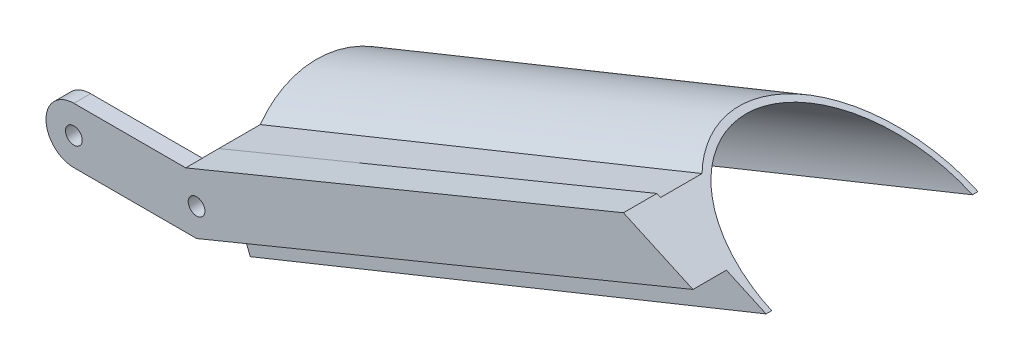
ISO-10303-21;
HEADER;
FILE_DESCRIPTION(('STEP AP214'),'2;1');
FILE_NAME('part.step','',(''),(''),'','','');
FILE_SCHEMA(('AUTOMOTIVE_DESIGN { 1 0 10303 214 1 1 1 1 }'));
ENDSEC;
DATA;
#1=APPLICATION_CONTEXT('core data for automotive mechanical design processes');
#2=APPLICATION_PROTOCOL_DEFINITION('international standard','automotive_design',2000,#1);
#3=PRODUCT_CONTEXT('',#1,'mechanical');
#4=PRODUCT('Part','Part','',(#3));
#5=PRODUCT_RELATED_PRODUCT_CATEGORY('part','',(#4));
#6=PRODUCT_DEFINITION_FORMATION('','',#4);
#7=PRODUCT_DEFINITION_CONTEXT('part definition',#1,'design');
#8=PRODUCT_DEFINITION('design','',#6,#7);
#9=PRODUCT_DEFINITION_SHAPE('','',#8);
#10=(LENGTH_UNIT() NAMED_UNIT(*) SI_UNIT(.MILLI.,.METRE.));
#11=(NAMED_UNIT(*) PLANE_ANGLE_UNIT() SI_UNIT($,.RADIAN.));
#12=(NAMED_UNIT(*) SI_UNIT($,.STERADIAN.) SOLID_ANGLE_UNIT());
#13=UNCERTAINTY_MEASURE_WITH_UNIT(LENGTH_MEASURE(1.E-05),#10,'distance_accuracy_value','');
#14=(GEOMETRIC_REPRESENTATION_CONTEXT(3) GLOBAL_UNCERTAINTY_ASSIGNED_CONTEXT((#13)) GLOBAL_UNIT_ASSIGNED_CONTEXT((#10,
#11,#12)) REPRESENTATION_CONTEXT('',''));
#15=CARTESIAN_POINT('',(0.,0.,0.));
#16=DIRECTION('',(0.,0.,1.));
#17=DIRECTION('',(1.,0.,0.));
#18=AXIS2_PLACEMENT_3D('',#15,#16,#17);
#19=CARTESIAN_POINT('',(22.,0.,-3.));
#20=DIRECTION('',(0.,0.,-1.));
#21=DIRECTION('',(-1.,0.,0.));
#22=AXIS2_PLACEMENT_3D('',#19,#20,#21);
#23=PLANE('',#22);
#24=DIRECTION('',(0.910039172794664,-0.414522259932087,0.));
#25=VECTOR('',#24,1.);
#26=CARTESIAN_POINT('',(111.008388468843,31.595772859895,-3.));
#27=LINE('',#26,#25);
#28=CARTESIAN_POINT('',(98.5445869727126,37.2730264528967,-3.));
#29=VERTEX_POINT('',#28);
#30=CARTESIAN_POINT('',(99.2027026899752,36.9732551654929,-3.));
#31=VERTEX_POINT('',#30);
#32=EDGE_CURVE('E222',#29,#31,#27,.T.);
#33=ORIENTED_EDGE('',*,*,#32,.T.);
#34=DIRECTION('',(-0.927208597794586,-0.374545345953994,0.));
#35=VECTOR('',#34,1.);
#36=CARTESIAN_POINT('',(150.967749391002,57.8837141183942,-3.));
#37=LINE('',#36,#35);
#38=CARTESIAN_POINT('',(19.9901870179728,4.97540790995101,-3.));
#39=VERTEX_POINT('',#38);
#40=EDGE_CURVE('E191',#31,#39,#37,.T.);
#41=ORIENTED_EDGE('',*,*,#40,.T.);
#42=DIRECTION('',(0.924878228166549,0.380263412733207,0.));
#43=VECTOR('',#42,1.);
#44=CARTESIAN_POINT('',(98.5445869727126,37.2730264528967,-3.));
#45=LINE('',#44,#43);
#46=EDGE_CURVE('E218',#39,#29,#45,.T.);
#47=ORIENTED_EDGE('',*,*,#46,.T.);
#48=EDGE_LOOP('',(#33,#41,#47));
#49=FACE_BOUND('',#48,.T.);
#50=ADVANCED_FACE('F41',(#49),#23,.T.);
#51=CARTESIAN_POINT('',(0.,0.,0.));
#52=DIRECTION('',(0.,0.,1.));
#53=DIRECTION('',(1.,0.,0.));
#54=AXIS2_PLACEMENT_3D('',#51,#52,#53);
#55=PLANE('',#54);
#56=CARTESIAN_POINT('',(0.,0.,0.));
#57=DIRECTION('',(0.,0.,1.));
#58=DIRECTION('',(1.,0.,0.));
#59=AXIS2_PLACEMENT_3D('',#56,#57,#58);
#60=CIRCLE('',#59,1.5);
#61=CARTESIAN_POINT('',(1.5,0.,0.));
#62=VERTEX_POINT('',#61);
#63=EDGE_CURVE('E298',#62,#62,#60,.T.);
#64=ORIENTED_EDGE('',*,*,#63,.T.);
#65=EDGE_LOOP('',(#64));
#66=FACE_BOUND('',#65,.T.);
#67=CARTESIAN_POINT('',(22.,0.,0.));
#68=DIRECTION('',(0.,0.,1.));
#69=DIRECTION('',(1.,0.,0.));
#70=AXIS2_PLACEMENT_3D('',#67,#68,#69);
#71=CIRCLE('',#70,1.5);
#72=CARTESIAN_POINT('',(23.5,0.,0.));
#73=VERTEX_POINT('',#72);
#74=EDGE_CURVE('E263',#73,#73,#71,.T.);
#75=ORIENTED_EDGE('',*,*,#74,.T.);
#76=EDGE_LOOP('',(#75));
#77=FACE_BOUND('',#76,.T.);
#78=DIRECTION('',(-0.374545345953993,0.927208597794587,0.));
#79=VECTOR('',#78,1.);
#80=CARTESIAN_POINT('',(22.936363364885,-2.31802149448646,0.));
#81=LINE('',#80,#79);
#82=CARTESIAN_POINT('',(23.7320771990458,-4.28785696671421,0.));
#83=VERTEX_POINT('',#82);
#84=CARTESIAN_POINT('',(22.936363364885,-2.31802149448646,0.));
#85=VERTEX_POINT('',#84);
#86=EDGE_CURVE('E214',#83,#85,#81,.T.);
#87=ORIENTED_EDGE('',*,*,#86,.F.);
#88=DIRECTION('',(-0.924878228166549,-0.380263412733207,0.));
#89=VECTOR('',#88,1.);
#90=CARTESIAN_POINT('',(4.9396925444234,-12.0143404155981,0.));
#91=LINE('',#90,#89);
#92=CARTESIAN_POINT('',(22.,-5.,0.));
#93=VERTEX_POINT('',#92);
#94=EDGE_CURVE('E302',#83,#93,#91,.T.);
#95=ORIENTED_EDGE('',*,*,#94,.T.);
#96=DIRECTION('',(1.,0.,0.));
#97=VECTOR('',#96,1.);
#98=CARTESIAN_POINT('',(0.,-5.,0.));
#99=LINE('',#98,#97);
#100=CARTESIAN_POINT('',(0.,-5.,0.));
#101=VERTEX_POINT('',#100);
#102=EDGE_CURVE('E272',#101,#93,#99,.T.);
#103=ORIENTED_EDGE('',*,*,#102,.F.);
#104=CARTESIAN_POINT('',(0.,0.,0.));
#105=DIRECTION('',(0.,0.,1.));
#106=DIRECTION('',(1.,0.,0.));
#107=AXIS2_PLACEMENT_3D('',#104,#105,#106);
#108=CIRCLE('',#107,5.);
#109=CARTESIAN_POINT('',(0.,5.,0.));
#110=VERTEX_POINT('',#109);
#111=EDGE_CURVE('E308',#110,#101,#108,.T.);
#112=ORIENTED_EDGE('',*,*,#111,.F.);
#113=DIRECTION('',(1.,0.,0.));
#114=VECTOR('',#113,1.);
#115=CARTESIAN_POINT('',(0.,5.,0.));
#116=LINE('',#115,#114);
#117=CARTESIAN_POINT('',(20.05,5.,0.));
#118=VERTEX_POINT('',#117);
#119=EDGE_CURVE('E305',#110,#118,#116,.T.);
#120=ORIENTED_EDGE('',*,*,#119,.T.);
#121=DIRECTION('',(0.924878228166549,0.380263412733207,0.));
#122=VECTOR('',#121,1.);
#123=CARTESIAN_POINT('',(98.5445869727126,37.2730264528967,0.));
#124=LINE('',#123,#122);
#125=CARTESIAN_POINT('',(19.9901870179728,4.97540790995101,0.));
#126=VERTEX_POINT('',#125);
#127=EDGE_CURVE('E57',#126,#118,#124,.T.);
#128=ORIENTED_EDGE('',*,*,#127,.F.);
#129=DIRECTION('',(-0.374545345953994,0.927208597794586,0.));
#130=VECTOR('',#129,1.);
#131=CARTESIAN_POINT('',(19.9901870179728,4.97540790995101,0.));
#132=LINE('',#131,#130);
#133=CARTESIAN_POINT('',(21.063636635115,2.31802149448647,0.));
#134=VERTEX_POINT('',#133);
#135=EDGE_CURVE('E235',#134,#126,#132,.T.);
#136=ORIENTED_EDGE('',*,*,#135,.F.);
#137=CARTESIAN_POINT('',(22.,0.,0.));
#138=DIRECTION('',(0.,0.,1.));
#139=DIRECTION('',(-1.,0.,0.));
#140=AXIS2_PLACEMENT_3D('',#137,#138,#139);
#141=CIRCLE('',#140,2.5);
#142=EDGE_CURVE('E63',#85,#134,#141,.T.);
#143=ORIENTED_EDGE('',*,*,#142,.F.);
#144=EDGE_LOOP('',(#87,#95,#103,#112,#120,#128,#136,#143));
#145=FACE_BOUND('',#144,.T.);
#146=ADVANCED_FACE('F330',(#66,#77,#145),#55,.F.);
#147=CARTESIAN_POINT('',(4.9396925444234,-12.0143404155981,3.));
#148=DIRECTION('',(0.380263412733207,-0.924878228166549,0.));
#149=DIRECTION('',(0.924878228166549,0.380263412733207,0.));
#150=AXIS2_PLACEMENT_3D('',#147,#148,#149);
#151=PLANE('',#150);
#152=ORIENTED_EDGE('',*,*,#94,.F.);
#153=DIRECTION('',(0.,0.,1.));
#154=VECTOR('',#153,1.);
#155=CARTESIAN_POINT('',(23.7320771990458,-4.28785696671419,-3.));
#156=LINE('',#155,#154);
#157=CARTESIAN_POINT('',(23.7320771990458,-4.28785696671419,-3.));
#158=VERTEX_POINT('',#157);
#159=EDGE_CURVE('E229',#158,#83,#156,.T.);
#160=ORIENTED_EDGE('',*,*,#159,.F.);
#161=DIRECTION('',(-0.924878228166549,-0.380263412733207,0.));
#162=VECTOR('',#161,1.);
#163=CARTESIAN_POINT('',(111.008388468843,31.595772859895,-3.));
#164=LINE('',#163,#162);
#165=CARTESIAN_POINT('',(111.008388468843,31.595772859895,-3.));
#166=VERTEX_POINT('',#165);
#167=EDGE_CURVE('E226',#166,#158,#164,.T.);
#168=ORIENTED_EDGE('',*,*,#167,.F.);
#169=DIRECTION('',(0.,0.,1.));
#170=VECTOR('',#169,1.);
#171=CARTESIAN_POINT('',(111.008388468843,31.595772859895,-70.0584015433783));
#172=LINE('',#171,#170);
#173=CARTESIAN_POINT('',(111.008388468843,31.595772859895,3.));
#174=VERTEX_POINT('',#173);
#175=EDGE_CURVE('E258',#166,#174,#172,.T.);
#176=ORIENTED_EDGE('',*,*,#175,.T.);
#177=DIRECTION('',(-0.924878228166549,-0.380263412733207,0.));
#178=VECTOR('',#177,1.);
#179=CARTESIAN_POINT('',(4.9396925444234,-12.0143404155981,3.));
#180=LINE('',#179,#178);
#181=CARTESIAN_POINT('',(22.,-5.,3.));
#182=VERTEX_POINT('',#181);
#183=EDGE_CURVE('E276',#174,#182,#180,.T.);
#184=ORIENTED_EDGE('',*,*,#183,.T.);
#185=DIRECTION('',(0.,0.,-1.));
#186=VECTOR('',#185,1.);
#187=CARTESIAN_POINT('',(22.,-5.,3.));
#188=LINE('',#187,#186);
#189=EDGE_CURVE('E294',#182,#93,#188,.T.);
#190=ORIENTED_EDGE('',*,*,#189,.T.);
#191=EDGE_LOOP('',(#152,#160,#168,#176,#184,#190));
#192=FACE_BOUND('',#191,.T.);
#193=ADVANCED_FACE('F357',(#192),#151,.T.);
#194=CARTESIAN_POINT('',(1.14074851739701,-2.77453321099285,3.));
#195=DIRECTION('',(-0.380263412733207,0.924878228166549,0.));
#196=DIRECTION('',(-0.924878228166549,-0.380263412733207,0.));
#197=AXIS2_PLACEMENT_3D('',#194,#195,#196);
#198=PLANE('',#197);
#199=DIRECTION('',(0.,0.,1.));
#200=VECTOR('',#199,1.);
#201=CARTESIAN_POINT('',(98.5445869727126,37.2730264528967,-70.0584015433783));
#202=LINE('',#201,#200);
#203=CARTESIAN_POINT('',(98.5445869727126,37.2730264528967,3.));
#204=VERTEX_POINT('',#203);
#205=EDGE_CURVE('E259',#29,#204,#202,.T.);
#206=ORIENTED_EDGE('',*,*,#205,.F.);
#207=ORIENTED_EDGE('',*,*,#46,.F.);
#208=DIRECTION('',(0.,0.,1.));
#209=VECTOR('',#208,1.);
#210=CARTESIAN_POINT('',(19.9901870179728,4.97540790995101,-3.));
#211=LINE('',#210,#209);
#212=EDGE_CURVE('E243',#39,#126,#211,.T.);
#213=ORIENTED_EDGE('',*,*,#212,.T.);
#214=ORIENTED_EDGE('',*,*,#127,.T.);
#215=DIRECTION('',(0.,0.,-1.));
#216=VECTOR('',#215,1.);
#217=CARTESIAN_POINT('',(20.05,5.,3.));
#218=LINE('',#217,#216);
#219=CARTESIAN_POINT('',(20.05,5.,3.));
#220=VERTEX_POINT('',#219);
#221=EDGE_CURVE('E11',#220,#118,#218,.T.);
#222=ORIENTED_EDGE('',*,*,#221,.F.);
#223=DIRECTION('',(0.924878228166549,0.380263412733207,0.));
#224=VECTOR('',#223,1.);
#225=CARTESIAN_POINT('',(1.14074851739701,-2.77453321099285,3.));
#226=LINE('',#225,#224);
#227=EDGE_CURVE('E280',#220,#204,#226,.T.);
#228=ORIENTED_EDGE('',*,*,#227,.T.);
#229=EDGE_LOOP('',(#206,#207,#213,#214,#222,#228));
#230=FACE_BOUND('',#229,.T.);
#231=ADVANCED_FACE('F334',(#230),#198,.T.);
#232=CARTESIAN_POINT('',(0.,5.,3.));
#233=DIRECTION('',(0.,1.,0.));
#234=DIRECTION('',(0.,0.,1.));
#235=AXIS2_PLACEMENT_3D('',#232,#233,#234);
#236=PLANE('',#235);
#237=ORIENTED_EDGE('',*,*,#119,.F.);
#238=DIRECTION('',(0.,0.,-1.));
#239=VECTOR('',#238,1.);
#240=CARTESIAN_POINT('',(0.,5.,3.));
#241=LINE('',#240,#239);
#242=CARTESIAN_POINT('',(0.,5.,3.));
#243=VERTEX_POINT('',#242);
#244=EDGE_CURVE('E50',#243,#110,#241,.T.);
#245=ORIENTED_EDGE('',*,*,#244,.F.);
#246=DIRECTION('',(1.,0.,0.));
#247=VECTOR('',#246,1.);
#248=CARTESIAN_POINT('',(0.,5.,3.));
#249=LINE('',#248,#247);
#250=EDGE_CURVE('E283',#243,#220,#249,.T.);
#251=ORIENTED_EDGE('',*,*,#250,.T.);
#252=ORIENTED_EDGE('',*,*,#221,.T.);
#253=EDGE_LOOP('',(#237,#245,#251,#252));
#254=FACE_BOUND('',#253,.T.);
#255=ADVANCED_FACE('F331',(#254),#236,.T.);
#256=CARTESIAN_POINT('',(0.,0.,3.));
#257=DIRECTION('',(0.,0.,-1.));
#258=DIRECTION('',(-1.,0.,0.));
#259=AXIS2_PLACEMENT_3D('',#256,#257,#258);
#260=CYLINDRICAL_SURFACE('',#259,5.);
#261=ORIENTED_EDGE('',*,*,#111,.T.);
#262=DIRECTION('',(0.,0.,-1.));
#263=VECTOR('',#262,1.);
#264=CARTESIAN_POINT('',(0.,-5.,3.));
#265=LINE('',#264,#263);
#266=CARTESIAN_POINT('',(0.,-5.,3.));
#267=VERTEX_POINT('',#266);
#268=EDGE_CURVE('E318',#267,#101,#265,.T.);
#269=ORIENTED_EDGE('',*,*,#268,.F.);
#270=CARTESIAN_POINT('',(0.,0.,3.));
#271=DIRECTION('',(0.,0.,1.));
#272=DIRECTION('',(1.,0.,0.));
#273=AXIS2_PLACEMENT_3D('',#270,#271,#272);
#274=CIRCLE('',#273,5.);
#275=EDGE_CURVE('E287',#243,#267,#274,.T.);
#276=ORIENTED_EDGE('',*,*,#275,.F.);
#277=ORIENTED_EDGE('',*,*,#244,.T.);
#278=EDGE_LOOP('',(#261,#269,#276,#277));
#279=FACE_BOUND('',#278,.T.);
#280=ADVANCED_FACE('F325',(#279),#260,.T.);
#281=CARTESIAN_POINT('',(0.,0.,3.));
#282=DIRECTION('',(0.,0.,-1.));
#283=DIRECTION('',(-1.,0.,0.));
#284=AXIS2_PLACEMENT_3D('',#281,#282,#283);
#285=CYLINDRICAL_SURFACE('',#284,1.5);
#286=CARTESIAN_POINT('',(0.,0.,3.));
#287=DIRECTION('',(0.,0.,1.));
#288=DIRECTION('',(1.,0.,0.));
#289=AXIS2_PLACEMENT_3D('',#286,#287,#288);
#290=CIRCLE('',#289,1.5);
#291=CARTESIAN_POINT('',(1.5,0.,3.));
#292=VERTEX_POINT('',#291);
#293=EDGE_CURVE('E271',#292,#292,#290,.T.);
#294=ORIENTED_EDGE('',*,*,#293,.T.);
#295=EDGE_LOOP('',(#294));
#296=FACE_BOUND('',#295,.T.);
#297=ORIENTED_EDGE('',*,*,#63,.F.);
#298=EDGE_LOOP('',(#297));
#299=FACE_BOUND('',#298,.T.);
#300=ADVANCED_FACE('F370',(#296,#299),#285,.F.);
#301=CARTESIAN_POINT('',(22.,0.,3.));
#302=DIRECTION('',(0.,0.,-1.));
#303=DIRECTION('',(-1.,0.,0.));
#304=AXIS2_PLACEMENT_3D('',#301,#302,#303);
#305=CYLINDRICAL_SURFACE('',#304,1.5);
#306=CARTESIAN_POINT('',(22.,0.,3.));
#307=DIRECTION('',(0.,0.,1.));
#308=DIRECTION('',(1.,0.,0.));
#309=AXIS2_PLACEMENT_3D('',#306,#307,#308);
#310=CIRCLE('',#309,1.5);
#311=CARTESIAN_POINT('',(23.5,0.,3.));
#312=VERTEX_POINT('',#311);
#313=EDGE_CURVE('E267',#312,#312,#310,.T.);
#314=ORIENTED_EDGE('',*,*,#313,.T.);
#315=EDGE_LOOP('',(#314));
#316=FACE_BOUND('',#315,.T.);
#317=ORIENTED_EDGE('',*,*,#74,.F.);
#318=EDGE_LOOP('',(#317));
#319=FACE_BOUND('',#318,.T.);
#320=ADVANCED_FACE('F43',(#316,#319),#305,.F.);
#321=CARTESIAN_POINT('',(0.,-5.,3.));
#322=DIRECTION('',(0.,1.,0.));
#323=DIRECTION('',(0.,0.,1.));
#324=AXIS2_PLACEMENT_3D('',#321,#322,#323);
#325=PLANE('',#324);
#326=ORIENTED_EDGE('',*,*,#102,.T.);
#327=ORIENTED_EDGE('',*,*,#189,.F.);
#328=DIRECTION('',(1.,0.,0.));
#329=VECTOR('',#328,1.);
#330=CARTESIAN_POINT('',(0.,-5.,3.));
#331=LINE('',#330,#329);
#332=EDGE_CURVE('E291',#267,#182,#331,.T.);
#333=ORIENTED_EDGE('',*,*,#332,.F.);
#334=ORIENTED_EDGE('',*,*,#268,.T.);
#335=EDGE_LOOP('',(#326,#327,#333,#334));
#336=FACE_BOUND('',#335,.T.);
#337=ADVANCED_FACE('F360',(#336),#325,.F.);
#338=CARTESIAN_POINT('',(0.,0.,3.));
#339=DIRECTION('',(0.,0.,1.));
#340=DIRECTION('',(1.,0.,0.));
#341=AXIS2_PLACEMENT_3D('',#338,#339,#340);
#342=PLANE('',#341);
#343=ORIENTED_EDGE('',*,*,#313,.F.);
#344=EDGE_LOOP('',(#343));
#345=FACE_BOUND('',#344,.T.);
#346=ORIENTED_EDGE('',*,*,#293,.F.);
#347=EDGE_LOOP('',(#346));
#348=FACE_BOUND('',#347,.T.);
#349=ORIENTED_EDGE('',*,*,#183,.F.);
#350=DIRECTION('',(-0.910039172794664,0.414522259932087,0.));
#351=VECTOR('',#350,1.);
#352=CARTESIAN_POINT('',(98.5445869727126,37.2730264528967,3.));
#353=LINE('',#352,#351);
#354=EDGE_CURVE('E254',#174,#204,#353,.T.);
#355=ORIENTED_EDGE('',*,*,#354,.T.);
#356=ORIENTED_EDGE('',*,*,#227,.F.);
#357=ORIENTED_EDGE('',*,*,#250,.F.);
#358=ORIENTED_EDGE('',*,*,#275,.T.);
#359=ORIENTED_EDGE('',*,*,#332,.T.);
#360=EDGE_LOOP('',(#349,#355,#356,#357,#358,#359));
#361=FACE_BOUND('',#360,.T.);
#362=ADVANCED_FACE('F336',(#345,#348,#361),#342,.T.);
#363=CARTESIAN_POINT('',(98.5445869727126,37.2730264528967,-70.0584015433783));
#364=DIRECTION('',(0.414522259932087,0.910039172794664,0.));
#365=DIRECTION('',(-0.910039172794664,0.414522259932087,0.));
#366=AXIS2_PLACEMENT_3D('',#363,#364,#365);
#367=PLANE('',#366);
#368=ORIENTED_EDGE('',*,*,#175,.F.);
#369=DIRECTION('',(-0.910039172794664,0.414522259932087,0.));
#370=VECTOR('',#369,1.);
#371=CARTESIAN_POINT('',(144.134507408542,16.5068469145482,-3.00000000000001));
#372=LINE('',#371,#370);
#373=CARTESIAN_POINT('',(118.12130064962,28.3558459204646,-3.00000000000001));
#374=VERTEX_POINT('',#373);
#375=EDGE_CURVE('E192',#374,#166,#372,.T.);
#376=ORIENTED_EDGE('',*,*,#375,.F.);
#377=DIRECTION('',(0.,0.,1.));
#378=VECTOR('',#377,1.);
#379=CARTESIAN_POINT('',(118.12130064962,28.3558459204646,-3.00000000000001));
#380=LINE('',#379,#378);
#381=CARTESIAN_POINT('',(118.12130064962,28.3558459204646,-4.));
#382=VERTEX_POINT('',#381);
#383=EDGE_CURVE('E196',#382,#374,#380,.T.);
#384=ORIENTED_EDGE('',*,*,#383,.F.);
#385=CARTESIAN_POINT('',(118.12130064962,28.3558459204646,-22.));
#386=DIRECTION('',(0.414522259932087,0.910039172794664,0.));
#387=DIRECTION('',(-0.910039172794664,0.414522259932087,0.));
#388=AXIS2_PLACEMENT_3D('',#385,#386,#387);
#389=ELLIPSE('',#388,24.8207548438683,18.);
#390=CARTESIAN_POINT('',(118.12130064962,28.3558459204646,-40.));
#391=VERTEX_POINT('',#390);
#392=EDGE_CURVE('E158',#391,#382,#389,.T.);
#393=ORIENTED_EDGE('',*,*,#392,.F.);
#394=DIRECTION('',(0.,0.,1.));
#395=VECTOR('',#394,1.);
#396=CARTESIAN_POINT('',(118.12130064962,28.3558459204646,-41.));
#397=LINE('',#396,#395);
#398=CARTESIAN_POINT('',(118.12130064962,28.3558459204646,-41.));
#399=VERTEX_POINT('',#398);
#400=EDGE_CURVE('E150',#399,#391,#397,.T.);
#401=ORIENTED_EDGE('',*,*,#400,.F.);
#402=CARTESIAN_POINT('',(118.12130064962,28.3558459204646,-22.));
#403=DIRECTION('',(0.414522259932087,0.910039172794664,0.));
#404=DIRECTION('',(-0.910039172794664,0.414522259932087,0.));
#405=AXIS2_PLACEMENT_3D('',#402,#403,#404);
#406=ELLIPSE('',#405,26.1996856685276,19.);
#407=CARTESIAN_POINT('',(99.2027026899752,36.9732551654929,-10.4365247501282));
#408=VERTEX_POINT('',#407);
#409=EDGE_CURVE('E155',#408,#399,#406,.F.);
#410=ORIENTED_EDGE('',*,*,#409,.F.);
#411=DIRECTION('',(0.,0.,-1.));
#412=VECTOR('',#411,1.);
#413=CARTESIAN_POINT('',(99.2027026899752,36.9732551654929,-3.00000000000003));
#414=LINE('',#413,#412);
#415=EDGE_CURVE('E188',#31,#408,#414,.T.);
#416=ORIENTED_EDGE('',*,*,#415,.F.);
#417=ORIENTED_EDGE('',*,*,#32,.F.);
#418=ORIENTED_EDGE('',*,*,#205,.T.);
#419=ORIENTED_EDGE('',*,*,#354,.F.);
#420=EDGE_LOOP('',(#368,#376,#384,#393,#401,#410,#416,#417,#418,#419));
#421=FACE_BOUND('',#420,.T.);
#422=ADVANCED_FACE('F153',(#421),#367,.T.);
#423=CARTESIAN_POINT('',(22.936363364885,-2.31802149448646,-3.));
#424=DIRECTION('',(0.927208597794587,0.374545345953993,0.));
#425=DIRECTION('',(-0.374545345953993,0.927208597794587,0.));
#426=AXIS2_PLACEMENT_3D('',#423,#424,#425);
#427=PLANE('',#426);
#428=ORIENTED_EDGE('',*,*,#86,.T.);
#429=DIRECTION('',(0.,0.,1.));
#430=VECTOR('',#429,1.);
#431=CARTESIAN_POINT('',(22.936363364885,-2.31802149448646,-3.));
#432=LINE('',#431,#430);
#433=CARTESIAN_POINT('',(22.936363364885,-2.31802149448646,-3.));
#434=VERTEX_POINT('',#433);
#435=EDGE_CURVE('E251',#434,#85,#432,.T.);
#436=ORIENTED_EDGE('',*,*,#435,.F.);
#437=DIRECTION('',(-0.374545345953994,0.927208597794586,0.));
#438=VECTOR('',#437,1.);
#439=CARTESIAN_POINT('',(25.6368359347664,-9.00319703317821,-3.00000000000001));
#440=LINE('',#439,#438);
#441=CARTESIAN_POINT('',(21.063636635115,2.31802149448647,-3.));
#442=VERTEX_POINT('',#441);
#443=EDGE_CURVE('E182',#434,#442,#440,.T.);
#444=ORIENTED_EDGE('',*,*,#443,.T.);
#445=DIRECTION('',(0.,0.,1.));
#446=VECTOR('',#445,1.);
#447=CARTESIAN_POINT('',(21.063636635115,2.31802149448647,-3.));
#448=LINE('',#447,#446);
#449=EDGE_CURVE('E247',#442,#134,#448,.T.);
#450=ORIENTED_EDGE('',*,*,#449,.T.);
#451=ORIENTED_EDGE('',*,*,#135,.T.);
#452=ORIENTED_EDGE('',*,*,#212,.F.);
#453=DIRECTION('',(0.,0.,-1.));
#454=VECTOR('',#453,1.);
#455=CARTESIAN_POINT('',(19.9901870179728,4.975407909951,-3.));
#456=LINE('',#455,#454);
#457=CARTESIAN_POINT('',(19.9901870179728,4.975407909951,-10.4365247501282));
#458=VERTEX_POINT('',#457);
#459=EDGE_CURVE('E186',#39,#458,#456,.T.);
#460=ORIENTED_EDGE('',*,*,#459,.T.);
#461=CARTESIAN_POINT('',(25.6368359347664,-9.00319703317821,-22.));
#462=DIRECTION('',(-0.927208597794586,-0.374545345953994,0.));
#463=DIRECTION('',(0.374545345953994,-0.927208597794586,0.));
#464=AXIS2_PLACEMENT_3D('',#461,#462,#463);
#465=CIRCLE('',#464,19.);
#466=CARTESIAN_POINT('',(25.6368359347664,-9.00319703317821,-41.));
#467=VERTEX_POINT('',#466);
#468=EDGE_CURVE('E589',#458,#467,#465,.T.);
#469=ORIENTED_EDGE('',*,*,#468,.T.);
#470=DIRECTION('',(0.,0.,1.));
#471=VECTOR('',#470,1.);
#472=CARTESIAN_POINT('',(25.6368359347664,-9.00319703317821,-41.));
#473=LINE('',#472,#471);
#474=CARTESIAN_POINT('',(25.6368359347664,-9.00319703317821,-40.));
#475=VERTEX_POINT('',#474);
#476=EDGE_CURVE('E168',#467,#475,#473,.T.);
#477=ORIENTED_EDGE('',*,*,#476,.T.);
#478=CARTESIAN_POINT('',(25.6368359347664,-9.00319703317821,-22.));
#479=DIRECTION('',(0.927208597794586,0.374545345953994,0.));
#480=DIRECTION('',(0.374545345953994,-0.927208597794586,0.));
#481=AXIS2_PLACEMENT_3D('',#478,#479,#480);
#482=CIRCLE('',#481,18.);
#483=CARTESIAN_POINT('',(25.6368359347664,-9.00319703317821,-4.));
#484=VERTEX_POINT('',#483);
#485=EDGE_CURVE('E586',#475,#484,#482,.T.);
#486=ORIENTED_EDGE('',*,*,#485,.T.);
#487=DIRECTION('',(0.,0.,1.));
#488=VECTOR('',#487,1.);
#489=CARTESIAN_POINT('',(25.6368359347664,-9.00319703317821,-3.00000000000001));
#490=LINE('',#489,#488);
#491=CARTESIAN_POINT('',(25.6368359347664,-9.00319703317821,-3.00000000000001));
#492=VERTEX_POINT('',#491);
#493=EDGE_CURVE('E583',#484,#492,#490,.T.);
#494=ORIENTED_EDGE('',*,*,#493,.T.);
#495=EDGE_CURVE('E178',#492,#158,#440,.T.);
#496=ORIENTED_EDGE('',*,*,#495,.T.);
#497=ORIENTED_EDGE('',*,*,#159,.T.);
#498=EDGE_LOOP('',(#428,#436,#444,#450,#451,#452,#460,#469,#477,#486,#494,#496,#497));
#499=FACE_BOUND('',#498,.T.);
#500=ADVANCED_FACE('F347',(#499),#427,.F.);
#501=CARTESIAN_POINT('',(22.,0.,-3.));
#502=DIRECTION('',(0.,0.,1.));
#503=DIRECTION('',(1.,0.,0.));
#504=AXIS2_PLACEMENT_3D('',#501,#502,#503);
#505=CYLINDRICAL_SURFACE('',#504,2.5);
#506=ORIENTED_EDGE('',*,*,#142,.T.);
#507=ORIENTED_EDGE('',*,*,#449,.F.);
#508=CARTESIAN_POINT('',(22.,0.,-3.));
#509=DIRECTION('',(0.,0.,1.));
#510=DIRECTION('',(-1.,0.,0.));
#511=AXIS2_PLACEMENT_3D('',#508,#509,#510);
#512=CIRCLE('',#511,2.5);
#513=EDGE_CURVE('E215',#434,#442,#512,.T.);
#514=ORIENTED_EDGE('',*,*,#513,.F.);
#515=ORIENTED_EDGE('',*,*,#435,.T.);
#516=EDGE_LOOP('',(#506,#507,#514,#515));
#517=FACE_BOUND('',#516,.T.);
#518=ADVANCED_FACE('F351',(#517),#505,.F.);
#519=CARTESIAN_POINT('',(156.614398307796,43.905109175265,-3.00000000000001));
#520=DIRECTION('',(0.,0.,1.));
#521=DIRECTION('',(0.,-1.,0.));
#522=AXIS2_PLACEMENT_3D('',#519,#520,#521);
#523=PLANE('',#522);
#524=ORIENTED_EDGE('',*,*,#443,.F.);
#525=ORIENTED_EDGE('',*,*,#513,.T.);
#526=EDGE_LOOP('',(#524,#525));
#527=FACE_BOUND('',#526,.T.);
#528=ADVANCED_FACE('F384',(#527),#523,.T.);
#529=CARTESIAN_POINT('',(156.614398307796,43.905109175265,-22.));
#530=DIRECTION('',(-0.927208597794586,-0.374545345953994,0.));
#531=DIRECTION('',(0.374545345953994,-0.927208597794586,0.));
#532=AXIS2_PLACEMENT_3D('',#529,#530,#531);
#533=CYLINDRICAL_SURFACE('',#532,19.);
#534=DIRECTION('',(-0.927208597794586,-0.374545345953994,0.));
#535=VECTOR('',#534,1.);
#536=CARTESIAN_POINT('',(150.967749391002,57.8837141183942,-10.4365247501282));
#537=LINE('',#536,#535);
#538=EDGE_CURVE('E176',#408,#458,#537,.T.);
#539=ORIENTED_EDGE('',*,*,#538,.F.);
#540=ORIENTED_EDGE('',*,*,#409,.T.);
#541=DIRECTION('',(-0.927208597794586,-0.374545345953994,0.));
#542=VECTOR('',#541,1.);
#543=CARTESIAN_POINT('',(156.614398307796,43.905109175265,-41.));
#544=LINE('',#543,#542);
#545=EDGE_CURVE('E163',#399,#467,#544,.T.);
#546=ORIENTED_EDGE('',*,*,#545,.T.);
#547=ORIENTED_EDGE('',*,*,#468,.F.);
#548=EDGE_LOOP('',(#539,#540,#546,#547));
#549=FACE_BOUND('',#548,.T.);
#550=ADVANCED_FACE('F175',(#549),#533,.T.);
#551=CARTESIAN_POINT('',(156.614398307796,43.905109175265,-41.));
#552=DIRECTION('',(0.374545345953994,-0.927208597794586,0.));
#553=DIRECTION('',(0.927208597794586,0.374545345953994,0.));
#554=AXIS2_PLACEMENT_3D('',#551,#552,#553);
#555=PLANE('',#554);
#556=ORIENTED_EDGE('',*,*,#545,.F.);
#557=ORIENTED_EDGE('',*,*,#400,.T.);
#558=DIRECTION('',(-0.927208597794586,-0.374545345953994,0.));
#559=VECTOR('',#558,1.);
#560=CARTESIAN_POINT('',(156.614398307796,43.905109175265,-40.));
#561=LINE('',#560,#559);
#562=EDGE_CURVE('E162',#391,#475,#561,.T.);
#563=ORIENTED_EDGE('',*,*,#562,.T.);
#564=ORIENTED_EDGE('',*,*,#476,.F.);
#565=EDGE_LOOP('',(#556,#557,#563,#564));
#566=FACE_BOUND('',#565,.T.);
#567=ADVANCED_FACE('F166',(#566),#555,.T.);
#568=CARTESIAN_POINT('',(156.614398307796,43.905109175265,-22.));
#569=DIRECTION('',(-0.927208597794586,-0.374545345953994,0.));
#570=DIRECTION('',(0.374545345953994,-0.927208597794586,0.));
#571=AXIS2_PLACEMENT_3D('',#568,#569,#570);
#572=CYLINDRICAL_SURFACE('',#571,18.);
#573=ORIENTED_EDGE('',*,*,#562,.F.);
#574=ORIENTED_EDGE('',*,*,#392,.T.);
#575=DIRECTION('',(-0.927208597794586,-0.374545345953994,0.));
#576=VECTOR('',#575,1.);
#577=CARTESIAN_POINT('',(156.614398307796,43.905109175265,-4.));
#578=LINE('',#577,#576);
#579=EDGE_CURVE('E200',#382,#484,#578,.T.);
#580=ORIENTED_EDGE('',*,*,#579,.T.);
#581=ORIENTED_EDGE('',*,*,#485,.F.);
#582=EDGE_LOOP('',(#573,#574,#580,#581));
#583=FACE_BOUND('',#582,.T.);
#584=ADVANCED_FACE('F421',(#583),#572,.F.);
#585=CARTESIAN_POINT('',(156.614398307796,43.905109175265,-3.00000000000001));
#586=DIRECTION('',(0.374545345953994,-0.927208597794586,0.));
#587=DIRECTION('',(0.927208597794586,0.374545345953994,0.));
#588=AXIS2_PLACEMENT_3D('',#585,#586,#587);
#589=PLANE('',#588);
#590=ORIENTED_EDGE('',*,*,#579,.F.);
#591=ORIENTED_EDGE('',*,*,#383,.T.);
#592=DIRECTION('',(-0.927208597794586,-0.374545345953994,0.));
#593=VECTOR('',#592,1.);
#594=CARTESIAN_POINT('',(156.614398307796,43.905109175265,-3.00000000000001));
#595=LINE('',#594,#593);
#596=EDGE_CURVE('E195',#374,#492,#595,.T.);
#597=ORIENTED_EDGE('',*,*,#596,.T.);
#598=ORIENTED_EDGE('',*,*,#493,.F.);
#599=EDGE_LOOP('',(#590,#591,#597,#598));
#600=FACE_BOUND('',#599,.T.);
#601=ADVANCED_FACE('F427',(#600),#589,.T.);
#602=ORIENTED_EDGE('',*,*,#375,.T.);
#603=ORIENTED_EDGE('',*,*,#167,.T.);
#604=ORIENTED_EDGE('',*,*,#495,.F.);
#605=ORIENTED_EDGE('',*,*,#596,.F.);
#606=EDGE_LOOP('',(#602,#603,#604,#605));
#607=FACE_BOUND('',#606,.T.);
#608=ADVANCED_FACE('F410',(#607),#523,.T.);
#609=CARTESIAN_POINT('',(150.967749391002,57.8837141183942,-3.));
#610=DIRECTION('',(-0.374545345953994,0.927208597794586,0.));
#611=DIRECTION('',(-0.927208597794586,-0.374545345953994,0.));
#612=AXIS2_PLACEMENT_3D('',#609,#610,#611);
#613=PLANE('',#612);
#614=ORIENTED_EDGE('',*,*,#40,.F.);
#615=ORIENTED_EDGE('',*,*,#415,.T.);
#616=ORIENTED_EDGE('',*,*,#538,.T.);
#617=ORIENTED_EDGE('',*,*,#459,.F.);
#618=EDGE_LOOP('',(#614,#615,#616,#617));
#619=FACE_BOUND('',#618,.T.);
#620=ADVANCED_FACE('F442',(#619),#613,.T.);
#621=CLOSED_SHELL('',(#50,#146,#193,#231,#255,#280,#300,#320,#337,#362,#422,#500,#518,#528,#550,
#567,#584,#601,#608,#620));
#622=MANIFOLD_SOLID_BREP('B2',#621);
#623=ADVANCED_BREP_SHAPE_REPRESENTATION('',(#18,#622),#14);
#624=SHAPE_DEFINITION_REPRESENTATION(#9,#623);
ENDSEC;
END-ISO-10303-21;
